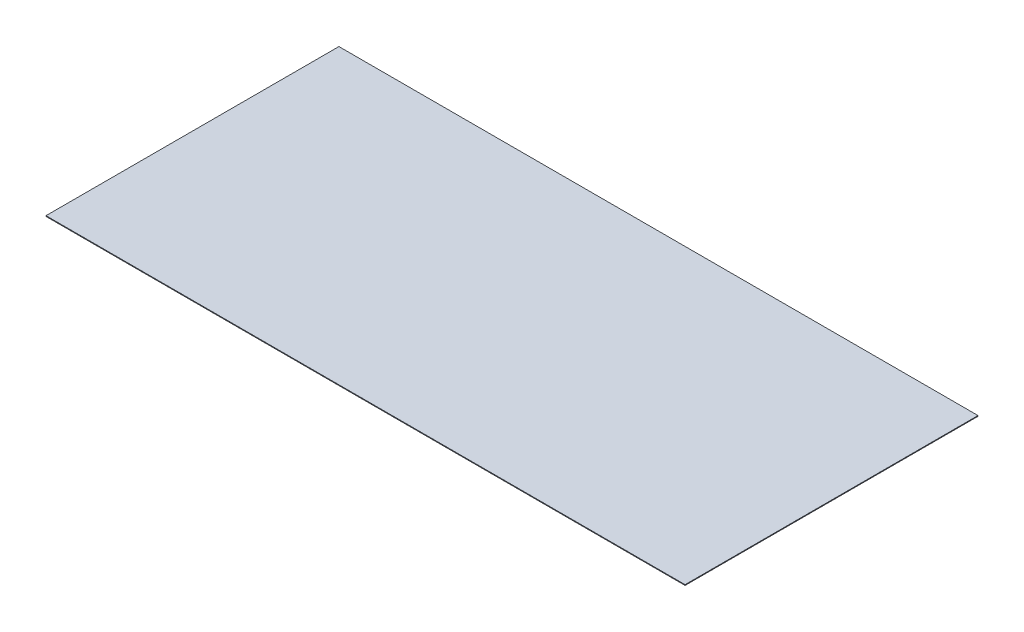
ISO-10303-21;
HEADER;
FILE_DESCRIPTION(('STEP AP214'),'2;1');
FILE_NAME('part.step','',(''),(''),'','','');
FILE_SCHEMA(('AUTOMOTIVE_DESIGN { 1 0 10303 214 1 1 1 1 }'));
ENDSEC;
DATA;
#1=APPLICATION_CONTEXT('core data for automotive mechanical design processes');
#2=APPLICATION_PROTOCOL_DEFINITION('international standard','automotive_design',2000,#1);
#3=PRODUCT_CONTEXT('',#1,'mechanical');
#4=PRODUCT('Part','Part','',(#3));
#5=PRODUCT_RELATED_PRODUCT_CATEGORY('part','',(#4));
#6=PRODUCT_DEFINITION_FORMATION('','',#4);
#7=PRODUCT_DEFINITION_CONTEXT('part definition',#1,'design');
#8=PRODUCT_DEFINITION('design','',#6,#7);
#9=PRODUCT_DEFINITION_SHAPE('','',#8);
#10=(LENGTH_UNIT() NAMED_UNIT(*) SI_UNIT(.MILLI.,.METRE.));
#11=(NAMED_UNIT(*) PLANE_ANGLE_UNIT() SI_UNIT($,.RADIAN.));
#12=(NAMED_UNIT(*) SI_UNIT($,.STERADIAN.) SOLID_ANGLE_UNIT());
#13=UNCERTAINTY_MEASURE_WITH_UNIT(LENGTH_MEASURE(1.E-05),#10,'distance_accuracy_value','');
#14=(GEOMETRIC_REPRESENTATION_CONTEXT(3) GLOBAL_UNCERTAINTY_ASSIGNED_CONTEXT((#13)) GLOBAL_UNIT_ASSIGNED_CONTEXT((#10,
#11,#12)) REPRESENTATION_CONTEXT('',''));
#15=CARTESIAN_POINT('',(0.,0.,0.));
#16=DIRECTION('',(0.,0.,1.));
#17=DIRECTION('',(1.,0.,0.));
#18=AXIS2_PLACEMENT_3D('',#15,#16,#17);
#19=CARTESIAN_POINT('',(-240.,0.531,-110.));
#20=DIRECTION('',(-1.,0.,0.));
#21=DIRECTION('',(0.,0.,1.));
#22=AXIS2_PLACEMENT_3D('',#19,#20,#21);
#23=PLANE('',#22);
#24=DIRECTION('',(0.,1.,0.));
#25=VECTOR('',#24,1.);
#26=CARTESIAN_POINT('',(-240.,0.531,-110.));
#27=LINE('',#26,#25);
#28=CARTESIAN_POINT('',(-240.,0.,-110.));
#29=VERTEX_POINT('',#28);
#30=CARTESIAN_POINT('',(-240.,0.531,-110.));
#31=VERTEX_POINT('',#30);
#32=EDGE_CURVE('E11',#29,#31,#27,.T.);
#33=ORIENTED_EDGE('',*,*,#32,.F.);
#34=DIRECTION('',(0.,0.,1.));
#35=VECTOR('',#34,1.);
#36=CARTESIAN_POINT('',(-240.,0.,0.));
#37=LINE('',#36,#35);
#38=CARTESIAN_POINT('',(-240.,0.,110.));
#39=VERTEX_POINT('',#38);
#40=EDGE_CURVE('E98',#29,#39,#37,.T.);
#41=ORIENTED_EDGE('',*,*,#40,.T.);
#42=DIRECTION('',(0.,1.,0.));
#43=VECTOR('',#42,1.);
#44=CARTESIAN_POINT('',(-240.,0.531,110.));
#45=LINE('',#44,#43);
#46=CARTESIAN_POINT('',(-240.,0.531,110.));
#47=VERTEX_POINT('',#46);
#48=EDGE_CURVE('E53',#39,#47,#45,.T.);
#49=ORIENTED_EDGE('',*,*,#48,.T.);
#50=DIRECTION('',(0.,0.,1.));
#51=VECTOR('',#50,1.);
#52=CARTESIAN_POINT('',(-240.,0.531,-110.));
#53=LINE('',#52,#51);
#54=EDGE_CURVE('E118',#31,#47,#53,.T.);
#55=ORIENTED_EDGE('',*,*,#54,.F.);
#56=EDGE_LOOP('',(#33,#41,#49,#55));
#57=FACE_BOUND('',#56,.T.);
#58=ADVANCED_FACE('F42',(#57),#23,.T.);
#59=CARTESIAN_POINT('',(-240.,0.531,110.));
#60=DIRECTION('',(0.,0.,1.));
#61=DIRECTION('',(1.,0.,0.));
#62=AXIS2_PLACEMENT_3D('',#59,#60,#61);
#63=PLANE('',#62);
#64=ORIENTED_EDGE('',*,*,#48,.F.);
#65=DIRECTION('',(1.,0.,0.));
#66=VECTOR('',#65,1.);
#67=CARTESIAN_POINT('',(0.,0.,110.));
#68=LINE('',#67,#66);
#69=CARTESIAN_POINT('',(240.,0.,110.));
#70=VERTEX_POINT('',#69);
#71=EDGE_CURVE('E108',#39,#70,#68,.T.);
#72=ORIENTED_EDGE('',*,*,#71,.T.);
#73=DIRECTION('',(0.,1.,0.));
#74=VECTOR('',#73,1.);
#75=CARTESIAN_POINT('',(240.,0.531,110.));
#76=LINE('',#75,#74);
#77=CARTESIAN_POINT('',(240.,0.531,110.));
#78=VERTEX_POINT('',#77);
#79=EDGE_CURVE('E61',#70,#78,#76,.T.);
#80=ORIENTED_EDGE('',*,*,#79,.T.);
#81=DIRECTION('',(1.,0.,0.));
#82=VECTOR('',#81,1.);
#83=CARTESIAN_POINT('',(-240.,0.531,110.));
#84=LINE('',#83,#82);
#85=EDGE_CURVE('E92',#47,#78,#84,.T.);
#86=ORIENTED_EDGE('',*,*,#85,.F.);
#87=EDGE_LOOP('',(#64,#72,#80,#86));
#88=FACE_BOUND('',#87,.T.);
#89=ADVANCED_FACE('F123',(#88),#63,.T.);
#90=CARTESIAN_POINT('',(240.,0.531,-110.));
#91=DIRECTION('',(1.,0.,0.));
#92=DIRECTION('',(0.,0.,-1.));
#93=AXIS2_PLACEMENT_3D('',#90,#91,#92);
#94=PLANE('',#93);
#95=ORIENTED_EDGE('',*,*,#79,.F.);
#96=DIRECTION('',(0.,0.,1.));
#97=VECTOR('',#96,1.);
#98=CARTESIAN_POINT('',(240.,0.,0.));
#99=LINE('',#98,#97);
#100=CARTESIAN_POINT('',(240.,0.,-110.));
#101=VERTEX_POINT('',#100);
#102=EDGE_CURVE('E97',#70,#101,#99,.F.);
#103=ORIENTED_EDGE('',*,*,#102,.T.);
#104=DIRECTION('',(0.,1.,0.));
#105=VECTOR('',#104,1.);
#106=CARTESIAN_POINT('',(240.,0.531,-110.));
#107=LINE('',#106,#105);
#108=CARTESIAN_POINT('',(240.,0.531,-110.));
#109=VERTEX_POINT('',#108);
#110=EDGE_CURVE('E46',#101,#109,#107,.T.);
#111=ORIENTED_EDGE('',*,*,#110,.T.);
#112=DIRECTION('',(0.,0.,-1.));
#113=VECTOR('',#112,1.);
#114=CARTESIAN_POINT('',(240.,0.531,-110.));
#115=LINE('',#114,#113);
#116=EDGE_CURVE('E111',#78,#109,#115,.T.);
#117=ORIENTED_EDGE('',*,*,#116,.F.);
#118=EDGE_LOOP('',(#95,#103,#111,#117));
#119=FACE_BOUND('',#118,.T.);
#120=ADVANCED_FACE('F101',(#119),#94,.T.);
#121=CARTESIAN_POINT('',(-240.,0.531,-110.));
#122=DIRECTION('',(0.,0.,-1.));
#123=DIRECTION('',(-1.,0.,0.));
#124=AXIS2_PLACEMENT_3D('',#121,#122,#123);
#125=PLANE('',#124);
#126=DIRECTION('',(1.,0.,0.));
#127=VECTOR('',#126,1.);
#128=CARTESIAN_POINT('',(0.,0.,-110.));
#129=LINE('',#128,#127);
#130=EDGE_CURVE('E85',#101,#29,#129,.F.);
#131=ORIENTED_EDGE('',*,*,#130,.T.);
#132=ORIENTED_EDGE('',*,*,#32,.T.);
#133=DIRECTION('',(-1.,0.,0.));
#134=VECTOR('',#133,1.);
#135=CARTESIAN_POINT('',(-240.,0.531,-110.));
#136=LINE('',#135,#134);
#137=EDGE_CURVE('E87',#109,#31,#136,.T.);
#138=ORIENTED_EDGE('',*,*,#137,.F.);
#139=ORIENTED_EDGE('',*,*,#110,.F.);
#140=EDGE_LOOP('',(#131,#132,#138,#139));
#141=FACE_BOUND('',#140,.T.);
#142=ADVANCED_FACE('F44',(#141),#125,.T.);
#143=CARTESIAN_POINT('',(0.,0.531,0.));
#144=DIRECTION('',(0.,1.,0.));
#145=DIRECTION('',(0.,0.,1.));
#146=AXIS2_PLACEMENT_3D('',#143,#144,#145);
#147=PLANE('',#146);
#148=ORIENTED_EDGE('',*,*,#116,.T.);
#149=ORIENTED_EDGE('',*,*,#137,.T.);
#150=ORIENTED_EDGE('',*,*,#54,.T.);
#151=ORIENTED_EDGE('',*,*,#85,.T.);
#152=EDGE_LOOP('',(#148,#149,#150,#151));
#153=FACE_BOUND('',#152,.T.);
#154=ADVANCED_FACE('F121',(#153),#147,.T.);
#155=CARTESIAN_POINT('',(0.,0.,0.));
#156=DIRECTION('',(0.,1.,0.));
#157=DIRECTION('',(0.,0.,1.));
#158=AXIS2_PLACEMENT_3D('',#155,#156,#157);
#159=PLANE('',#158);
#160=ORIENTED_EDGE('',*,*,#102,.F.);
#161=ORIENTED_EDGE('',*,*,#71,.F.);
#162=ORIENTED_EDGE('',*,*,#40,.F.);
#163=ORIENTED_EDGE('',*,*,#130,.F.);
#164=EDGE_LOOP('',(#160,#161,#162,#163));
#165=FACE_BOUND('',#164,.T.);
#166=ADVANCED_FACE('F95',(#165),#159,.F.);
#167=CLOSED_SHELL('',(#58,#89,#120,#142,#154,#166));
#168=MANIFOLD_SOLID_BREP('B2',#167);
#169=ADVANCED_BREP_SHAPE_REPRESENTATION('',(#18,#168),#14);
#170=SHAPE_DEFINITION_REPRESENTATION(#9,#169);
ENDSEC;
END-ISO-10303-21;
